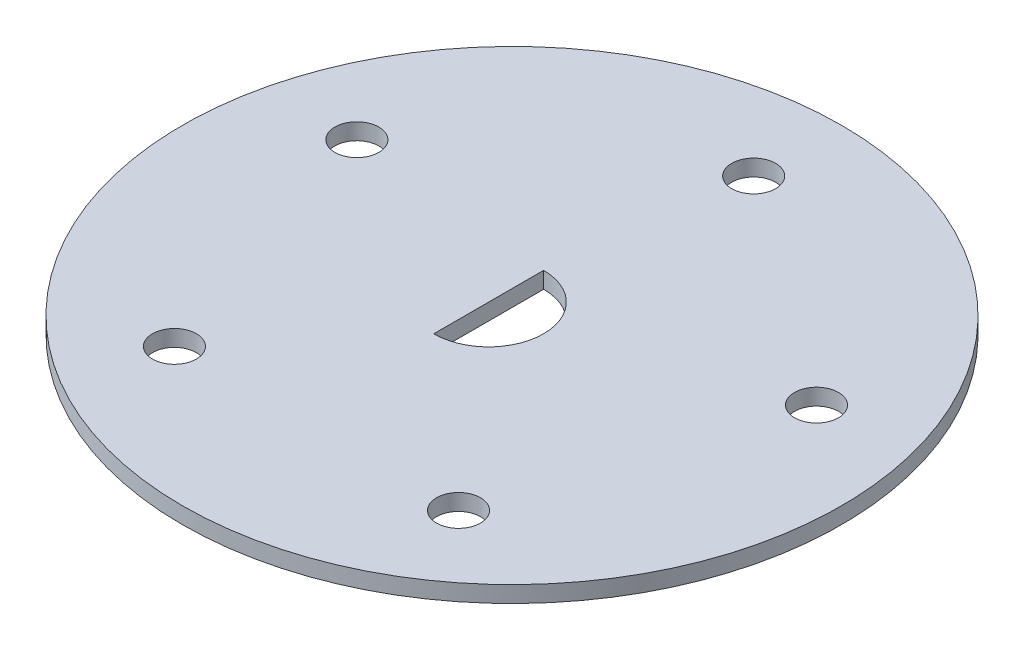
ISO-10303-21;
HEADER;
FILE_DESCRIPTION(('STEP AP214'),'2;1');
FILE_NAME('part.step','',(''),(''),'','','');
FILE_SCHEMA(('AUTOMOTIVE_DESIGN { 1 0 10303 214 1 1 1 1 }'));
ENDSEC;
DATA;
#1=APPLICATION_CONTEXT('core data for automotive mechanical design processes');
#2=APPLICATION_PROTOCOL_DEFINITION('international standard','automotive_design',2000,#1);
#3=PRODUCT_CONTEXT('',#1,'mechanical');
#4=PRODUCT('Part','Part','',(#3));
#5=PRODUCT_RELATED_PRODUCT_CATEGORY('part','',(#4));
#6=PRODUCT_DEFINITION_FORMATION('','',#4);
#7=PRODUCT_DEFINITION_CONTEXT('part definition',#1,'design');
#8=PRODUCT_DEFINITION('design','',#6,#7);
#9=PRODUCT_DEFINITION_SHAPE('','',#8);
#10=(LENGTH_UNIT() NAMED_UNIT(*) SI_UNIT(.MILLI.,.METRE.));
#11=(NAMED_UNIT(*) PLANE_ANGLE_UNIT() SI_UNIT($,.RADIAN.));
#12=(NAMED_UNIT(*) SI_UNIT($,.STERADIAN.) SOLID_ANGLE_UNIT());
#13=UNCERTAINTY_MEASURE_WITH_UNIT(LENGTH_MEASURE(1.E-05),#10,'distance_accuracy_value','');
#14=(GEOMETRIC_REPRESENTATION_CONTEXT(3) GLOBAL_UNCERTAINTY_ASSIGNED_CONTEXT((#13)) GLOBAL_UNIT_ASSIGNED_CONTEXT((#10,
#11,#12)) REPRESENTATION_CONTEXT('',''));
#15=CARTESIAN_POINT('',(0.,0.,0.));
#16=DIRECTION('',(0.,0.,1.));
#17=DIRECTION('',(1.,0.,0.));
#18=AXIS2_PLACEMENT_3D('',#15,#16,#17);
#19=CARTESIAN_POINT('',(-2.69502370610227,1.89738,0.));
#20=DIRECTION('',(1.,0.,0.));
#21=DIRECTION('',(0.,0.,-1.));
#22=AXIS2_PLACEMENT_3D('',#19,#20,#21);
#23=PLANE('',#22);
#24=DIRECTION('',(0.,0.,1.));
#25=VECTOR('',#24,1.);
#26=CARTESIAN_POINT('',(-2.69502370610227,0.,0.));
#27=LINE('',#26,#25);
#28=CARTESIAN_POINT('',(-2.69502370610227,0.,-6.35));
#29=VERTEX_POINT('',#28);
#30=CARTESIAN_POINT('',(-2.69502370610228,0.,6.35));
#31=VERTEX_POINT('',#30);
#32=EDGE_CURVE('E77',#29,#31,#27,.T.);
#33=ORIENTED_EDGE('',*,*,#32,.F.);
#34=DIRECTION('',(0.,-1.,0.));
#35=VECTOR('',#34,1.);
#36=CARTESIAN_POINT('',(-2.69502370610227,1.89738,-6.35));
#37=LINE('',#36,#35);
#38=CARTESIAN_POINT('',(-2.69502370610227,1.89738,-6.35));
#39=VERTEX_POINT('',#38);
#40=EDGE_CURVE('E11',#39,#29,#37,.T.);
#41=ORIENTED_EDGE('',*,*,#40,.F.);
#42=DIRECTION('',(0.,0.,1.));
#43=VECTOR('',#42,1.);
#44=CARTESIAN_POINT('',(-2.69502370610227,1.89738,0.));
#45=LINE('',#44,#43);
#46=CARTESIAN_POINT('',(-2.69502370610228,1.89738,6.35));
#47=VERTEX_POINT('',#46);
#48=EDGE_CURVE('E78',#39,#47,#45,.T.);
#49=ORIENTED_EDGE('',*,*,#48,.T.);
#50=DIRECTION('',(0.,-1.,0.));
#51=VECTOR('',#50,1.);
#52=CARTESIAN_POINT('',(-2.69502370610228,1.89738,6.35));
#53=LINE('',#52,#51);
#54=EDGE_CURVE('E57',#47,#31,#53,.T.);
#55=ORIENTED_EDGE('',*,*,#54,.T.);
#56=EDGE_LOOP('',(#33,#41,#49,#55));
#57=FACE_BOUND('',#56,.T.);
#58=ADVANCED_FACE('F47',(#57),#23,.T.);
#59=CARTESIAN_POINT('',(0.,1.89738,0.));
#60=DIRECTION('',(0.,-1.,0.));
#61=DIRECTION('',(0.,0.,-1.));
#62=AXIS2_PLACEMENT_3D('',#59,#60,#61);
#63=CYLINDRICAL_SURFACE('',#62,38.1);
#64=CARTESIAN_POINT('',(0.,1.89738,0.));
#65=DIRECTION('',(0.,1.,0.));
#66=DIRECTION('',(0.,0.,1.));
#67=AXIS2_PLACEMENT_3D('',#64,#65,#66);
#68=CIRCLE('',#67,38.1);
#69=CARTESIAN_POINT('',(0.,1.89738,-38.1));
#70=VERTEX_POINT('',#69);
#71=EDGE_CURVE('E118',#70,#70,#68,.T.);
#72=CARTESIAN_POINT('',(0.,0.,0.));
#73=DIRECTION('',(0.,1.,0.));
#74=DIRECTION('',(0.,0.,1.));
#75=AXIS2_PLACEMENT_3D('',#72,#73,#74);
#76=CIRCLE('',#75,38.1);
#77=CARTESIAN_POINT('',(0.,0.,-38.1));
#78=VERTEX_POINT('',#77);
#79=EDGE_CURVE('E88',#78,#78,#76,.T.);
#80=CARTESIAN_POINT('',(0.,1.89738,-38.1));
#81=CARTESIAN_POINT('',(0.,1.877615625,-38.1));
#82=CARTESIAN_POINT('',(0.,1.85785125,-38.1));
#83=CARTESIAN_POINT('',(0.,1.8183225,-38.1));
#84=CARTESIAN_POINT('',(0.,1.798558125,-38.1));
#85=CARTESIAN_POINT('',(0.,1.759029375,-38.1));
#86=CARTESIAN_POINT('',(0.,1.739265,-38.1));
#87=CARTESIAN_POINT('',(0.,1.69973625,-38.1));
#88=CARTESIAN_POINT('',(0.,1.679971875,-38.1));
#89=CARTESIAN_POINT('',(0.,1.640443125,-38.1));
#90=CARTESIAN_POINT('',(0.,1.62067875,-38.1));
#91=CARTESIAN_POINT('',(0.,1.58115,-38.1));
#92=CARTESIAN_POINT('',(0.,1.561385625,-38.1));
#93=CARTESIAN_POINT('',(0.,1.521856875,-38.1));
#94=CARTESIAN_POINT('',(0.,1.5020925,-38.1));
#95=CARTESIAN_POINT('',(0.,1.46256375,-38.1));
#96=CARTESIAN_POINT('',(0.,1.442799375,-38.1));
#97=CARTESIAN_POINT('',(0.,1.403270625,-38.1));
#98=CARTESIAN_POINT('',(0.,1.38350625,-38.1));
#99=CARTESIAN_POINT('',(0.,1.3439775,-38.1));
#100=CARTESIAN_POINT('',(0.,1.324213125,-38.1));
#101=CARTESIAN_POINT('',(0.,1.284684375,-38.1));
#102=CARTESIAN_POINT('',(0.,1.26492,-38.1));
#103=CARTESIAN_POINT('',(0.,1.22539125,-38.1));
#104=CARTESIAN_POINT('',(0.,1.205626875,-38.1));
#105=CARTESIAN_POINT('',(0.,1.166098125,-38.1));
#106=CARTESIAN_POINT('',(0.,1.14633375,-38.1));
#107=CARTESIAN_POINT('',(0.,1.106805,-38.1));
#108=CARTESIAN_POINT('',(0.,1.087040625,-38.1));
#109=CARTESIAN_POINT('',(0.,1.047511875,-38.1));
#110=CARTESIAN_POINT('',(0.,1.0277475,-38.1));
#111=CARTESIAN_POINT('',(0.,0.98821875,-38.1));
#112=CARTESIAN_POINT('',(0.,0.968454375,-38.1));
#113=CARTESIAN_POINT('',(0.,0.928925625,-38.1));
#114=CARTESIAN_POINT('',(0.,0.90916125,-38.1));
#115=CARTESIAN_POINT('',(0.,0.8696325,-38.1));
#116=CARTESIAN_POINT('',(0.,0.849868125,-38.1));
#117=CARTESIAN_POINT('',(0.,0.810339375,-38.1));
#118=CARTESIAN_POINT('',(0.,0.790575,-38.1));
#119=CARTESIAN_POINT('',(0.,0.75104625,-38.1));
#120=CARTESIAN_POINT('',(0.,0.731281875,-38.1));
#121=CARTESIAN_POINT('',(0.,0.691753125,-38.1));
#122=CARTESIAN_POINT('',(0.,0.67198875,-38.1));
#123=CARTESIAN_POINT('',(0.,0.63246,-38.1));
#124=CARTESIAN_POINT('',(0.,0.612695625,-38.1));
#125=CARTESIAN_POINT('',(0.,0.573166875,-38.1));
#126=CARTESIAN_POINT('',(0.,0.5534025,-38.1));
#127=CARTESIAN_POINT('',(0.,0.51387375,-38.1));
#128=CARTESIAN_POINT('',(0.,0.494109375,-38.1));
#129=CARTESIAN_POINT('',(0.,0.454580625,-38.1));
#130=CARTESIAN_POINT('',(0.,0.43481625,-38.1));
#131=CARTESIAN_POINT('',(0.,0.3952875,-38.1));
#132=CARTESIAN_POINT('',(0.,0.375523125,-38.1));
#133=CARTESIAN_POINT('',(0.,0.335994375,-38.1));
#134=CARTESIAN_POINT('',(0.,0.31623,-38.1));
#135=CARTESIAN_POINT('',(0.,0.27670125,-38.1));
#136=CARTESIAN_POINT('',(0.,0.256936875,-38.1));
#137=CARTESIAN_POINT('',(0.,0.217408125,-38.1));
#138=CARTESIAN_POINT('',(0.,0.19764375,-38.1));
#139=CARTESIAN_POINT('',(0.,0.158115,-38.1));
#140=CARTESIAN_POINT('',(0.,0.138350625,-38.1));
#141=CARTESIAN_POINT('',(0.,0.098821875,-38.1));
#142=CARTESIAN_POINT('',(0.,0.0790574999999999,-38.1));
#143=CARTESIAN_POINT('',(0.,0.0395287499999999,-38.1));
#144=CARTESIAN_POINT('',(0.,0.019764375,-38.1));
#145=CARTESIAN_POINT('',(0.,0.,-38.1));
#146=B_SPLINE_CURVE_WITH_KNOTS('',3,(#80,#81,#82,#83,#84,#85,#86,#87,#88,#89,#90,#91,#92,#93,
#94,#95,#96,#97,#98,#99,#100,#101,#102,#103,#104,#105,#106,#107,#108,#109,#110,#111,#112,#113,
#114,#115,#116,#117,#118,#119,#120,#121,#122,#123,#124,#125,#126,#127,#128,#129,#130,#131,#132,
#133,#134,#135,#136,#137,#138,#139,#140,#141,#142,#143,#144,#145),.UNSPECIFIED.,.F.,.F.,(4,2,2,
2,2,2,2,2,2,2,2,2,2,2,2,2,2,2,2,2,2,2,2,2,2,2,2,2,2,2,2,2,4),(0.,0.0592931249999999,0.11858625,
0.177879375,0.2371725,0.296465625,0.35575875,0.415051875,0.474345,0.533638125,0.59293125,
0.652224375,0.7115175,0.770810625,0.83010375,0.889396875,0.94869,1.007983125,1.06727625,
1.126569375,1.1858625,1.245155625,1.30444875,1.363741875,1.423035,1.482328125,1.54162125,
1.600914375,1.6602075,1.719500625,1.77879375,1.838086875,1.89738),.UNSPECIFIED.);
#147=EDGE_CURVE('BSEAM158',#70,#78,#146,.T.);
#148=ORIENTED_EDGE('',*,*,#71,.F.);
#149=ORIENTED_EDGE('',*,*,#79,.T.);
#150=ORIENTED_EDGE('',*,*,#147,.T.);
#151=ORIENTED_EDGE('',*,*,#147,.F.);
#152=EDGE_LOOP('',(#148,#150,#149,#151));
#153=FACE_BOUND('',#152,.T.);
#154=ADVANCED_FACE('F158',(#153),#63,.T.);
#155=CARTESIAN_POINT('',(0.,1.89738,-27.94));
#156=DIRECTION('',(0.,-1.,0.));
#157=DIRECTION('',(0.,0.,-1.));
#158=AXIS2_PLACEMENT_3D('',#155,#156,#157);
#159=CYLINDRICAL_SURFACE('',#158,2.54);
#160=CARTESIAN_POINT('',(0.,1.89738,-27.94));
#161=DIRECTION('',(0.,1.,0.));
#162=DIRECTION('',(0.,0.,1.));
#163=AXIS2_PLACEMENT_3D('',#160,#161,#162);
#164=CIRCLE('',#163,2.54);
#165=CARTESIAN_POINT('',(0.,1.89738,-30.48));
#166=VERTEX_POINT('',#165);
#167=EDGE_CURVE('E122',#166,#166,#164,.T.);
#168=CARTESIAN_POINT('',(0.,0.,-27.94));
#169=DIRECTION('',(0.,1.,0.));
#170=DIRECTION('',(0.,0.,1.));
#171=AXIS2_PLACEMENT_3D('',#168,#169,#170);
#172=CIRCLE('',#171,2.54);
#173=CARTESIAN_POINT('',(0.,0.,-30.48));
#174=VERTEX_POINT('',#173);
#175=EDGE_CURVE('E92',#174,#174,#172,.T.);
#176=CARTESIAN_POINT('',(0.,1.89738,-30.48));
#177=CARTESIAN_POINT('',(0.,1.877615625,-30.48));
#178=CARTESIAN_POINT('',(0.,1.85785125,-30.48));
#179=CARTESIAN_POINT('',(0.,1.8183225,-30.48));
#180=CARTESIAN_POINT('',(0.,1.798558125,-30.48));
#181=CARTESIAN_POINT('',(0.,1.759029375,-30.48));
#182=CARTESIAN_POINT('',(0.,1.739265,-30.48));
#183=CARTESIAN_POINT('',(0.,1.69973625,-30.48));
#184=CARTESIAN_POINT('',(0.,1.679971875,-30.48));
#185=CARTESIAN_POINT('',(0.,1.640443125,-30.48));
#186=CARTESIAN_POINT('',(0.,1.62067875,-30.48));
#187=CARTESIAN_POINT('',(0.,1.58115,-30.48));
#188=CARTESIAN_POINT('',(0.,1.561385625,-30.48));
#189=CARTESIAN_POINT('',(0.,1.521856875,-30.48));
#190=CARTESIAN_POINT('',(0.,1.5020925,-30.48));
#191=CARTESIAN_POINT('',(0.,1.46256375,-30.48));
#192=CARTESIAN_POINT('',(0.,1.442799375,-30.48));
#193=CARTESIAN_POINT('',(0.,1.403270625,-30.48));
#194=CARTESIAN_POINT('',(0.,1.38350625,-30.48));
#195=CARTESIAN_POINT('',(0.,1.3439775,-30.48));
#196=CARTESIAN_POINT('',(0.,1.324213125,-30.48));
#197=CARTESIAN_POINT('',(0.,1.284684375,-30.48));
#198=CARTESIAN_POINT('',(0.,1.26492,-30.48));
#199=CARTESIAN_POINT('',(0.,1.22539125,-30.48));
#200=CARTESIAN_POINT('',(0.,1.205626875,-30.48));
#201=CARTESIAN_POINT('',(0.,1.166098125,-30.48));
#202=CARTESIAN_POINT('',(0.,1.14633375,-30.48));
#203=CARTESIAN_POINT('',(0.,1.106805,-30.48));
#204=CARTESIAN_POINT('',(0.,1.087040625,-30.48));
#205=CARTESIAN_POINT('',(0.,1.047511875,-30.48));
#206=CARTESIAN_POINT('',(0.,1.0277475,-30.48));
#207=CARTESIAN_POINT('',(0.,0.98821875,-30.48));
#208=CARTESIAN_POINT('',(0.,0.968454375,-30.48));
#209=CARTESIAN_POINT('',(0.,0.928925625,-30.48));
#210=CARTESIAN_POINT('',(0.,0.90916125,-30.48));
#211=CARTESIAN_POINT('',(0.,0.8696325,-30.48));
#212=CARTESIAN_POINT('',(0.,0.849868125,-30.48));
#213=CARTESIAN_POINT('',(0.,0.810339375,-30.48));
#214=CARTESIAN_POINT('',(0.,0.790575,-30.48));
#215=CARTESIAN_POINT('',(0.,0.75104625,-30.48));
#216=CARTESIAN_POINT('',(0.,0.731281875,-30.48));
#217=CARTESIAN_POINT('',(0.,0.691753125,-30.48));
#218=CARTESIAN_POINT('',(0.,0.67198875,-30.48));
#219=CARTESIAN_POINT('',(0.,0.63246,-30.48));
#220=CARTESIAN_POINT('',(0.,0.612695625,-30.48));
#221=CARTESIAN_POINT('',(0.,0.573166875,-30.48));
#222=CARTESIAN_POINT('',(0.,0.5534025,-30.48));
#223=CARTESIAN_POINT('',(0.,0.51387375,-30.48));
#224=CARTESIAN_POINT('',(0.,0.494109375,-30.48));
#225=CARTESIAN_POINT('',(0.,0.454580625,-30.48));
#226=CARTESIAN_POINT('',(0.,0.43481625,-30.48));
#227=CARTESIAN_POINT('',(0.,0.3952875,-30.48));
#228=CARTESIAN_POINT('',(0.,0.375523125,-30.48));
#229=CARTESIAN_POINT('',(0.,0.335994375,-30.48));
#230=CARTESIAN_POINT('',(0.,0.31623,-30.48));
#231=CARTESIAN_POINT('',(0.,0.27670125,-30.48));
#232=CARTESIAN_POINT('',(0.,0.256936875,-30.48));
#233=CARTESIAN_POINT('',(0.,0.217408125,-30.48));
#234=CARTESIAN_POINT('',(0.,0.19764375,-30.48));
#235=CARTESIAN_POINT('',(0.,0.158115,-30.48));
#236=CARTESIAN_POINT('',(0.,0.138350625,-30.48));
#237=CARTESIAN_POINT('',(0.,0.098821875,-30.48));
#238=CARTESIAN_POINT('',(0.,0.0790574999999999,-30.48));
#239=CARTESIAN_POINT('',(0.,0.0395287499999999,-30.48));
#240=CARTESIAN_POINT('',(0.,0.019764375,-30.48));
#241=CARTESIAN_POINT('',(0.,0.,-30.48));
#242=B_SPLINE_CURVE_WITH_KNOTS('',3,(#176,#177,#178,#179,#180,#181,#182,#183,#184,#185,#186,
#187,#188,#189,#190,#191,#192,#193,#194,#195,#196,#197,#198,#199,#200,#201,#202,#203,#204,#205,
#206,#207,#208,#209,#210,#211,#212,#213,#214,#215,#216,#217,#218,#219,#220,#221,#222,#223,#224,
#225,#226,#227,#228,#229,#230,#231,#232,#233,#234,#235,#236,#237,#238,#239,#240,#241),
.UNSPECIFIED.,.F.,.F.,(4,2,2,2,2,2,2,2,2,2,2,2,2,2,2,2,2,2,2,2,2,2,2,2,2,2,2,2,2,2,2,2,4),(0.,
0.0592931249999999,0.11858625,0.177879375,0.2371725,0.296465625,0.35575875,0.415051875,0.474345,
0.533638125,0.59293125,0.652224375,0.7115175,0.770810625,0.83010375,0.889396875,0.94869,
1.007983125,1.06727625,1.126569375,1.1858625,1.245155625,1.30444875,1.363741875,1.423035,
1.482328125,1.54162125,1.600914375,1.6602075,1.719500625,1.77879375,1.838086875,1.89738),.UNSPECIFIED.);
#243=EDGE_CURVE('BSEAM161',#166,#174,#242,.T.);
#244=ORIENTED_EDGE('',*,*,#167,.T.);
#245=ORIENTED_EDGE('',*,*,#175,.F.);
#246=ORIENTED_EDGE('',*,*,#243,.T.);
#247=ORIENTED_EDGE('',*,*,#243,.F.);
#248=EDGE_LOOP('',(#244,#246,#245,#247));
#249=FACE_BOUND('',#248,.T.);
#250=ADVANCED_FACE('F161',(#249),#159,.F.);
#251=CARTESIAN_POINT('',(26.5725190652866,1.89738,-8.63393482283596));
#252=DIRECTION('',(0.,-1.,0.));
#253=DIRECTION('',(0.,0.,-1.));
#254=AXIS2_PLACEMENT_3D('',#251,#252,#253);
#255=CYLINDRICAL_SURFACE('',#254,2.54000000000001);
#256=CARTESIAN_POINT('',(26.5725190652866,1.89738,-8.63393482283596));
#257=DIRECTION('',(0.,1.,0.));
#258=DIRECTION('',(0.,0.,1.));
#259=AXIS2_PLACEMENT_3D('',#256,#257,#258);
#260=CIRCLE('',#259,2.54000000000001);
#261=CARTESIAN_POINT('',(26.5725190652866,1.89738,-11.173934822836));
#262=VERTEX_POINT('',#261);
#263=EDGE_CURVE('E126',#262,#262,#260,.T.);
#264=CARTESIAN_POINT('',(26.5725190652866,0.,-8.63393482283596));
#265=DIRECTION('',(0.,1.,0.));
#266=DIRECTION('',(0.,0.,1.));
#267=AXIS2_PLACEMENT_3D('',#264,#265,#266);
#268=CIRCLE('',#267,2.54000000000001);
#269=CARTESIAN_POINT('',(26.5725190652866,0.,-11.173934822836));
#270=VERTEX_POINT('',#269);
#271=EDGE_CURVE('E98',#270,#270,#268,.T.);
#272=CARTESIAN_POINT('',(26.5725190652866,1.89738,-11.173934822836));
#273=CARTESIAN_POINT('',(26.5725190652866,1.877615625,-11.173934822836));
#274=CARTESIAN_POINT('',(26.5725190652866,1.85785125,-11.173934822836));
#275=CARTESIAN_POINT('',(26.5725190652866,1.8183225,-11.173934822836));
#276=CARTESIAN_POINT('',(26.5725190652866,1.798558125,-11.173934822836));
#277=CARTESIAN_POINT('',(26.5725190652866,1.759029375,-11.173934822836));
#278=CARTESIAN_POINT('',(26.5725190652866,1.739265,-11.173934822836));
#279=CARTESIAN_POINT('',(26.5725190652866,1.69973625,-11.173934822836));
#280=CARTESIAN_POINT('',(26.5725190652866,1.679971875,-11.173934822836));
#281=CARTESIAN_POINT('',(26.5725190652866,1.640443125,-11.173934822836));
#282=CARTESIAN_POINT('',(26.5725190652866,1.62067875,-11.173934822836));
#283=CARTESIAN_POINT('',(26.5725190652866,1.58115,-11.173934822836));
#284=CARTESIAN_POINT('',(26.5725190652866,1.561385625,-11.173934822836));
#285=CARTESIAN_POINT('',(26.5725190652866,1.521856875,-11.173934822836));
#286=CARTESIAN_POINT('',(26.5725190652866,1.5020925,-11.173934822836));
#287=CARTESIAN_POINT('',(26.5725190652866,1.46256375,-11.173934822836));
#288=CARTESIAN_POINT('',(26.5725190652866,1.442799375,-11.173934822836));
#289=CARTESIAN_POINT('',(26.5725190652866,1.403270625,-11.173934822836));
#290=CARTESIAN_POINT('',(26.5725190652866,1.38350625,-11.173934822836));
#291=CARTESIAN_POINT('',(26.5725190652866,1.3439775,-11.173934822836));
#292=CARTESIAN_POINT('',(26.5725190652866,1.324213125,-11.173934822836));
#293=CARTESIAN_POINT('',(26.5725190652866,1.284684375,-11.173934822836));
#294=CARTESIAN_POINT('',(26.5725190652866,1.26492,-11.173934822836));
#295=CARTESIAN_POINT('',(26.5725190652866,1.22539125,-11.173934822836));
#296=CARTESIAN_POINT('',(26.5725190652866,1.205626875,-11.173934822836));
#297=CARTESIAN_POINT('',(26.5725190652866,1.166098125,-11.173934822836));
#298=CARTESIAN_POINT('',(26.5725190652866,1.14633375,-11.173934822836));
#299=CARTESIAN_POINT('',(26.5725190652866,1.106805,-11.173934822836));
#300=CARTESIAN_POINT('',(26.5725190652866,1.087040625,-11.173934822836));
#301=CARTESIAN_POINT('',(26.5725190652866,1.047511875,-11.173934822836));
#302=CARTESIAN_POINT('',(26.5725190652866,1.0277475,-11.173934822836));
#303=CARTESIAN_POINT('',(26.5725190652866,0.98821875,-11.173934822836));
#304=CARTESIAN_POINT('',(26.5725190652866,0.968454375,-11.173934822836));
#305=CARTESIAN_POINT('',(26.5725190652866,0.928925625,-11.173934822836));
#306=CARTESIAN_POINT('',(26.5725190652866,0.90916125,-11.173934822836));
#307=CARTESIAN_POINT('',(26.5725190652866,0.8696325,-11.173934822836));
#308=CARTESIAN_POINT('',(26.5725190652866,0.849868125,-11.173934822836));
#309=CARTESIAN_POINT('',(26.5725190652866,0.810339375,-11.173934822836));
#310=CARTESIAN_POINT('',(26.5725190652866,0.790575,-11.173934822836));
#311=CARTESIAN_POINT('',(26.5725190652866,0.75104625,-11.173934822836));
#312=CARTESIAN_POINT('',(26.5725190652866,0.731281875,-11.173934822836));
#313=CARTESIAN_POINT('',(26.5725190652866,0.691753125,-11.173934822836));
#314=CARTESIAN_POINT('',(26.5725190652866,0.67198875,-11.173934822836));
#315=CARTESIAN_POINT('',(26.5725190652866,0.63246,-11.173934822836));
#316=CARTESIAN_POINT('',(26.5725190652866,0.612695625,-11.173934822836));
#317=CARTESIAN_POINT('',(26.5725190652866,0.573166875,-11.173934822836));
#318=CARTESIAN_POINT('',(26.5725190652866,0.5534025,-11.173934822836));
#319=CARTESIAN_POINT('',(26.5725190652866,0.51387375,-11.173934822836));
#320=CARTESIAN_POINT('',(26.5725190652866,0.494109375,-11.173934822836));
#321=CARTESIAN_POINT('',(26.5725190652866,0.454580625,-11.173934822836));
#322=CARTESIAN_POINT('',(26.5725190652866,0.43481625,-11.173934822836));
#323=CARTESIAN_POINT('',(26.5725190652866,0.3952875,-11.173934822836));
#324=CARTESIAN_POINT('',(26.5725190652866,0.375523125,-11.173934822836));
#325=CARTESIAN_POINT('',(26.5725190652866,0.335994375,-11.173934822836));
#326=CARTESIAN_POINT('',(26.5725190652866,0.31623,-11.173934822836));
#327=CARTESIAN_POINT('',(26.5725190652866,0.27670125,-11.173934822836));
#328=CARTESIAN_POINT('',(26.5725190652866,0.256936875,-11.173934822836));
#329=CARTESIAN_POINT('',(26.5725190652866,0.217408125,-11.173934822836));
#330=CARTESIAN_POINT('',(26.5725190652866,0.19764375,-11.173934822836));
#331=CARTESIAN_POINT('',(26.5725190652866,0.158115,-11.173934822836));
#332=CARTESIAN_POINT('',(26.5725190652866,0.138350625,-11.173934822836));
#333=CARTESIAN_POINT('',(26.5725190652866,0.098821875,-11.173934822836));
#334=CARTESIAN_POINT('',(26.5725190652866,0.0790574999999999,-11.173934822836));
#335=CARTESIAN_POINT('',(26.5725190652866,0.0395287499999999,-11.173934822836));
#336=CARTESIAN_POINT('',(26.5725190652866,0.019764375,-11.173934822836));
#337=CARTESIAN_POINT('',(26.5725190652866,0.,-11.173934822836));
#338=B_SPLINE_CURVE_WITH_KNOTS('',3,(#272,#273,#274,#275,#276,#277,#278,#279,#280,#281,#282,
#283,#284,#285,#286,#287,#288,#289,#290,#291,#292,#293,#294,#295,#296,#297,#298,#299,#300,#301,
#302,#303,#304,#305,#306,#307,#308,#309,#310,#311,#312,#313,#314,#315,#316,#317,#318,#319,#320,
#321,#322,#323,#324,#325,#326,#327,#328,#329,#330,#331,#332,#333,#334,#335,#336,#337),
.UNSPECIFIED.,.F.,.F.,(4,2,2,2,2,2,2,2,2,2,2,2,2,2,2,2,2,2,2,2,2,2,2,2,2,2,2,2,2,2,2,2,4),(0.,
0.0592931249999999,0.11858625,0.177879375,0.2371725,0.296465625,0.35575875,0.415051875,0.474345,
0.533638125,0.59293125,0.652224375,0.7115175,0.770810625,0.83010375,0.889396875,0.94869,
1.007983125,1.06727625,1.126569375,1.1858625,1.245155625,1.30444875,1.363741875,1.423035,
1.482328125,1.54162125,1.600914375,1.6602075,1.719500625,1.77879375,1.838086875,1.89738),.UNSPECIFIED.);
#339=EDGE_CURVE('BSEAM179',#262,#270,#338,.T.);
#340=ORIENTED_EDGE('',*,*,#263,.T.);
#341=ORIENTED_EDGE('',*,*,#271,.F.);
#342=ORIENTED_EDGE('',*,*,#339,.T.);
#343=ORIENTED_EDGE('',*,*,#339,.F.);
#344=EDGE_LOOP('',(#340,#342,#341,#343));
#345=FACE_BOUND('',#344,.T.);
#346=ADVANCED_FACE('F179',(#345),#255,.F.);
#347=CARTESIAN_POINT('',(16.4227199490516,1.89738,22.6039348228361));
#348=DIRECTION('',(0.,-1.,0.));
#349=DIRECTION('',(0.,0.,-1.));
#350=AXIS2_PLACEMENT_3D('',#347,#348,#349);
#351=CYLINDRICAL_SURFACE('',#350,2.54);
#352=CARTESIAN_POINT('',(16.4227199490516,1.89738,22.6039348228361));
#353=DIRECTION('',(0.,1.,0.));
#354=DIRECTION('',(0.,0.,1.));
#355=AXIS2_PLACEMENT_3D('',#352,#353,#354);
#356=CIRCLE('',#355,2.54);
#357=CARTESIAN_POINT('',(16.4227199490516,1.89738,20.0639348228361));
#358=VERTEX_POINT('',#357);
#359=EDGE_CURVE('E130',#358,#358,#356,.T.);
#360=CARTESIAN_POINT('',(16.4227199490516,0.,22.6039348228361));
#361=DIRECTION('',(0.,1.,0.));
#362=DIRECTION('',(0.,0.,1.));
#363=AXIS2_PLACEMENT_3D('',#360,#361,#362);
#364=CIRCLE('',#363,2.54);
#365=CARTESIAN_POINT('',(16.4227199490516,0.,20.0639348228361));
#366=VERTEX_POINT('',#365);
#367=EDGE_CURVE('E102',#366,#366,#364,.T.);
#368=CARTESIAN_POINT('',(16.4227199490516,1.89738,20.0639348228361));
#369=CARTESIAN_POINT('',(16.4227199490516,1.877615625,20.0639348228361));
#370=CARTESIAN_POINT('',(16.4227199490516,1.85785125,20.0639348228361));
#371=CARTESIAN_POINT('',(16.4227199490516,1.8183225,20.0639348228361));
#372=CARTESIAN_POINT('',(16.4227199490516,1.798558125,20.0639348228361));
#373=CARTESIAN_POINT('',(16.4227199490516,1.759029375,20.0639348228361));
#374=CARTESIAN_POINT('',(16.4227199490516,1.739265,20.0639348228361));
#375=CARTESIAN_POINT('',(16.4227199490516,1.69973625,20.0639348228361));
#376=CARTESIAN_POINT('',(16.4227199490516,1.679971875,20.0639348228361));
#377=CARTESIAN_POINT('',(16.4227199490516,1.640443125,20.0639348228361));
#378=CARTESIAN_POINT('',(16.4227199490516,1.62067875,20.0639348228361));
#379=CARTESIAN_POINT('',(16.4227199490516,1.58115,20.0639348228361));
#380=CARTESIAN_POINT('',(16.4227199490516,1.561385625,20.0639348228361));
#381=CARTESIAN_POINT('',(16.4227199490516,1.521856875,20.0639348228361));
#382=CARTESIAN_POINT('',(16.4227199490516,1.5020925,20.0639348228361));
#383=CARTESIAN_POINT('',(16.4227199490516,1.46256375,20.0639348228361));
#384=CARTESIAN_POINT('',(16.4227199490516,1.442799375,20.0639348228361));
#385=CARTESIAN_POINT('',(16.4227199490516,1.403270625,20.0639348228361));
#386=CARTESIAN_POINT('',(16.4227199490516,1.38350625,20.0639348228361));
#387=CARTESIAN_POINT('',(16.4227199490516,1.3439775,20.0639348228361));
#388=CARTESIAN_POINT('',(16.4227199490516,1.324213125,20.0639348228361));
#389=CARTESIAN_POINT('',(16.4227199490516,1.284684375,20.0639348228361));
#390=CARTESIAN_POINT('',(16.4227199490516,1.26492,20.0639348228361));
#391=CARTESIAN_POINT('',(16.4227199490516,1.22539125,20.0639348228361));
#392=CARTESIAN_POINT('',(16.4227199490516,1.205626875,20.0639348228361));
#393=CARTESIAN_POINT('',(16.4227199490516,1.166098125,20.0639348228361));
#394=CARTESIAN_POINT('',(16.4227199490516,1.14633375,20.0639348228361));
#395=CARTESIAN_POINT('',(16.4227199490516,1.106805,20.0639348228361));
#396=CARTESIAN_POINT('',(16.4227199490516,1.087040625,20.0639348228361));
#397=CARTESIAN_POINT('',(16.4227199490516,1.047511875,20.0639348228361));
#398=CARTESIAN_POINT('',(16.4227199490516,1.0277475,20.0639348228361));
#399=CARTESIAN_POINT('',(16.4227199490516,0.98821875,20.0639348228361));
#400=CARTESIAN_POINT('',(16.4227199490516,0.968454375,20.0639348228361));
#401=CARTESIAN_POINT('',(16.4227199490516,0.928925625,20.0639348228361));
#402=CARTESIAN_POINT('',(16.4227199490516,0.90916125,20.0639348228361));
#403=CARTESIAN_POINT('',(16.4227199490516,0.8696325,20.0639348228361));
#404=CARTESIAN_POINT('',(16.4227199490516,0.849868125,20.0639348228361));
#405=CARTESIAN_POINT('',(16.4227199490516,0.810339375,20.0639348228361));
#406=CARTESIAN_POINT('',(16.4227199490516,0.790575,20.0639348228361));
#407=CARTESIAN_POINT('',(16.4227199490516,0.75104625,20.0639348228361));
#408=CARTESIAN_POINT('',(16.4227199490516,0.731281875,20.0639348228361));
#409=CARTESIAN_POINT('',(16.4227199490516,0.691753125,20.0639348228361));
#410=CARTESIAN_POINT('',(16.4227199490516,0.67198875,20.0639348228361));
#411=CARTESIAN_POINT('',(16.4227199490516,0.63246,20.0639348228361));
#412=CARTESIAN_POINT('',(16.4227199490516,0.612695625,20.0639348228361));
#413=CARTESIAN_POINT('',(16.4227199490516,0.573166875,20.0639348228361));
#414=CARTESIAN_POINT('',(16.4227199490516,0.5534025,20.0639348228361));
#415=CARTESIAN_POINT('',(16.4227199490516,0.51387375,20.0639348228361));
#416=CARTESIAN_POINT('',(16.4227199490516,0.494109375,20.0639348228361));
#417=CARTESIAN_POINT('',(16.4227199490516,0.454580625,20.0639348228361));
#418=CARTESIAN_POINT('',(16.4227199490516,0.43481625,20.0639348228361));
#419=CARTESIAN_POINT('',(16.4227199490516,0.3952875,20.0639348228361));
#420=CARTESIAN_POINT('',(16.4227199490516,0.375523125,20.0639348228361));
#421=CARTESIAN_POINT('',(16.4227199490516,0.335994375,20.0639348228361));
#422=CARTESIAN_POINT('',(16.4227199490516,0.31623,20.0639348228361));
#423=CARTESIAN_POINT('',(16.4227199490516,0.27670125,20.0639348228361));
#424=CARTESIAN_POINT('',(16.4227199490516,0.256936875,20.0639348228361));
#425=CARTESIAN_POINT('',(16.4227199490516,0.217408125,20.0639348228361));
#426=CARTESIAN_POINT('',(16.4227199490516,0.19764375,20.0639348228361));
#427=CARTESIAN_POINT('',(16.4227199490516,0.158115,20.0639348228361));
#428=CARTESIAN_POINT('',(16.4227199490516,0.138350625,20.0639348228361));
#429=CARTESIAN_POINT('',(16.4227199490516,0.098821875,20.0639348228361));
#430=CARTESIAN_POINT('',(16.4227199490516,0.0790574999999999,20.0639348228361));
#431=CARTESIAN_POINT('',(16.4227199490516,0.0395287499999999,20.0639348228361));
#432=CARTESIAN_POINT('',(16.4227199490516,0.019764375,20.0639348228361));
#433=CARTESIAN_POINT('',(16.4227199490516,0.,20.0639348228361));
#434=B_SPLINE_CURVE_WITH_KNOTS('',3,(#368,#369,#370,#371,#372,#373,#374,#375,#376,#377,#378,
#379,#380,#381,#382,#383,#384,#385,#386,#387,#388,#389,#390,#391,#392,#393,#394,#395,#396,#397,
#398,#399,#400,#401,#402,#403,#404,#405,#406,#407,#408,#409,#410,#411,#412,#413,#414,#415,#416,
#417,#418,#419,#420,#421,#422,#423,#424,#425,#426,#427,#428,#429,#430,#431,#432,#433),
.UNSPECIFIED.,.F.,.F.,(4,2,2,2,2,2,2,2,2,2,2,2,2,2,2,2,2,2,2,2,2,2,2,2,2,2,2,2,2,2,2,2,4),(0.,
0.0592931249999999,0.11858625,0.177879375,0.2371725,0.296465625,0.35575875,0.415051875,0.474345,
0.533638125,0.59293125,0.652224375,0.7115175,0.770810625,0.83010375,0.889396875,0.94869,
1.007983125,1.06727625,1.126569375,1.1858625,1.245155625,1.30444875,1.363741875,1.423035,
1.482328125,1.54162125,1.600914375,1.6602075,1.719500625,1.77879375,1.838086875,1.89738),.UNSPECIFIED.);
#435=EDGE_CURVE('BSEAM183',#358,#366,#434,.T.);
#436=ORIENTED_EDGE('',*,*,#359,.T.);
#437=ORIENTED_EDGE('',*,*,#367,.F.);
#438=ORIENTED_EDGE('',*,*,#435,.T.);
#439=ORIENTED_EDGE('',*,*,#435,.F.);
#440=EDGE_LOOP('',(#436,#438,#437,#439));
#441=FACE_BOUND('',#440,.T.);
#442=ADVANCED_FACE('F183',(#441),#351,.F.);
#443=CARTESIAN_POINT('',(-16.4227199490519,1.89738,22.6039348228359));
#444=DIRECTION('',(0.,-1.,0.));
#445=DIRECTION('',(0.,0.,-1.));
#446=AXIS2_PLACEMENT_3D('',#443,#444,#445);
#447=CYLINDRICAL_SURFACE('',#446,2.54);
#448=CARTESIAN_POINT('',(-16.4227199490519,1.89738,22.6039348228359));
#449=DIRECTION('',(0.,1.,0.));
#450=DIRECTION('',(0.,0.,1.));
#451=AXIS2_PLACEMENT_3D('',#448,#449,#450);
#452=CIRCLE('',#451,2.54);
#453=CARTESIAN_POINT('',(-16.4227199490519,1.89738,20.0639348228359));
#454=VERTEX_POINT('',#453);
#455=EDGE_CURVE('E134',#454,#454,#452,.T.);
#456=CARTESIAN_POINT('',(-16.4227199490519,0.,22.6039348228359));
#457=DIRECTION('',(0.,1.,0.));
#458=DIRECTION('',(0.,0.,1.));
#459=AXIS2_PLACEMENT_3D('',#456,#457,#458);
#460=CIRCLE('',#459,2.54);
#461=CARTESIAN_POINT('',(-16.4227199490519,0.,20.0639348228359));
#462=VERTEX_POINT('',#461);
#463=EDGE_CURVE('E106',#462,#462,#460,.T.);
#464=CARTESIAN_POINT('',(-16.4227199490519,1.89738,20.0639348228359));
#465=CARTESIAN_POINT('',(-16.4227199490519,1.877615625,20.0639348228359));
#466=CARTESIAN_POINT('',(-16.4227199490519,1.85785125,20.0639348228359));
#467=CARTESIAN_POINT('',(-16.4227199490519,1.8183225,20.0639348228359));
#468=CARTESIAN_POINT('',(-16.4227199490519,1.798558125,20.0639348228359));
#469=CARTESIAN_POINT('',(-16.4227199490519,1.759029375,20.0639348228359));
#470=CARTESIAN_POINT('',(-16.4227199490519,1.739265,20.0639348228359));
#471=CARTESIAN_POINT('',(-16.4227199490519,1.69973625,20.0639348228359));
#472=CARTESIAN_POINT('',(-16.4227199490519,1.679971875,20.0639348228359));
#473=CARTESIAN_POINT('',(-16.4227199490519,1.640443125,20.0639348228359));
#474=CARTESIAN_POINT('',(-16.4227199490519,1.62067875,20.0639348228359));
#475=CARTESIAN_POINT('',(-16.4227199490519,1.58115,20.0639348228359));
#476=CARTESIAN_POINT('',(-16.4227199490519,1.561385625,20.0639348228359));
#477=CARTESIAN_POINT('',(-16.4227199490519,1.521856875,20.0639348228359));
#478=CARTESIAN_POINT('',(-16.4227199490519,1.5020925,20.0639348228359));
#479=CARTESIAN_POINT('',(-16.4227199490519,1.46256375,20.0639348228359));
#480=CARTESIAN_POINT('',(-16.4227199490519,1.442799375,20.0639348228359));
#481=CARTESIAN_POINT('',(-16.4227199490519,1.403270625,20.0639348228359));
#482=CARTESIAN_POINT('',(-16.4227199490519,1.38350625,20.0639348228359));
#483=CARTESIAN_POINT('',(-16.4227199490519,1.3439775,20.0639348228359));
#484=CARTESIAN_POINT('',(-16.4227199490519,1.324213125,20.0639348228359));
#485=CARTESIAN_POINT('',(-16.4227199490519,1.284684375,20.0639348228359));
#486=CARTESIAN_POINT('',(-16.4227199490519,1.26492,20.0639348228359));
#487=CARTESIAN_POINT('',(-16.4227199490519,1.22539125,20.0639348228359));
#488=CARTESIAN_POINT('',(-16.4227199490519,1.205626875,20.0639348228359));
#489=CARTESIAN_POINT('',(-16.4227199490519,1.166098125,20.0639348228359));
#490=CARTESIAN_POINT('',(-16.4227199490519,1.14633375,20.0639348228359));
#491=CARTESIAN_POINT('',(-16.4227199490519,1.106805,20.0639348228359));
#492=CARTESIAN_POINT('',(-16.4227199490519,1.087040625,20.0639348228359));
#493=CARTESIAN_POINT('',(-16.4227199490519,1.047511875,20.0639348228359));
#494=CARTESIAN_POINT('',(-16.4227199490519,1.0277475,20.0639348228359));
#495=CARTESIAN_POINT('',(-16.4227199490519,0.98821875,20.0639348228359));
#496=CARTESIAN_POINT('',(-16.4227199490519,0.968454375,20.0639348228359));
#497=CARTESIAN_POINT('',(-16.4227199490519,0.928925625,20.0639348228359));
#498=CARTESIAN_POINT('',(-16.4227199490519,0.90916125,20.0639348228359));
#499=CARTESIAN_POINT('',(-16.4227199490519,0.8696325,20.0639348228359));
#500=CARTESIAN_POINT('',(-16.4227199490519,0.849868125,20.0639348228359));
#501=CARTESIAN_POINT('',(-16.4227199490519,0.810339375,20.0639348228359));
#502=CARTESIAN_POINT('',(-16.4227199490519,0.790575,20.0639348228359));
#503=CARTESIAN_POINT('',(-16.4227199490519,0.75104625,20.0639348228359));
#504=CARTESIAN_POINT('',(-16.4227199490519,0.731281875,20.0639348228359));
#505=CARTESIAN_POINT('',(-16.4227199490519,0.691753125,20.0639348228359));
#506=CARTESIAN_POINT('',(-16.4227199490519,0.67198875,20.0639348228359));
#507=CARTESIAN_POINT('',(-16.4227199490519,0.63246,20.0639348228359));
#508=CARTESIAN_POINT('',(-16.4227199490519,0.612695625,20.0639348228359));
#509=CARTESIAN_POINT('',(-16.4227199490519,0.573166875,20.0639348228359));
#510=CARTESIAN_POINT('',(-16.4227199490519,0.5534025,20.0639348228359));
#511=CARTESIAN_POINT('',(-16.4227199490519,0.51387375,20.0639348228359));
#512=CARTESIAN_POINT('',(-16.4227199490519,0.494109375,20.0639348228359));
#513=CARTESIAN_POINT('',(-16.4227199490519,0.454580625,20.0639348228359));
#514=CARTESIAN_POINT('',(-16.4227199490519,0.43481625,20.0639348228359));
#515=CARTESIAN_POINT('',(-16.4227199490519,0.3952875,20.0639348228359));
#516=CARTESIAN_POINT('',(-16.4227199490519,0.375523125,20.0639348228359));
#517=CARTESIAN_POINT('',(-16.4227199490519,0.335994375,20.0639348228359));
#518=CARTESIAN_POINT('',(-16.4227199490519,0.31623,20.0639348228359));
#519=CARTESIAN_POINT('',(-16.4227199490519,0.27670125,20.0639348228359));
#520=CARTESIAN_POINT('',(-16.4227199490519,0.256936875,20.0639348228359));
#521=CARTESIAN_POINT('',(-16.4227199490519,0.217408125,20.0639348228359));
#522=CARTESIAN_POINT('',(-16.4227199490519,0.19764375,20.0639348228359));
#523=CARTESIAN_POINT('',(-16.4227199490519,0.158115,20.0639348228359));
#524=CARTESIAN_POINT('',(-16.4227199490519,0.138350625,20.0639348228359));
#525=CARTESIAN_POINT('',(-16.4227199490519,0.098821875,20.0639348228359));
#526=CARTESIAN_POINT('',(-16.4227199490519,0.0790574999999999,20.0639348228359));
#527=CARTESIAN_POINT('',(-16.4227199490519,0.0395287499999999,20.0639348228359));
#528=CARTESIAN_POINT('',(-16.4227199490519,0.019764375,20.0639348228359));
#529=CARTESIAN_POINT('',(-16.4227199490519,0.,20.0639348228359));
#530=B_SPLINE_CURVE_WITH_KNOTS('',3,(#464,#465,#466,#467,#468,#469,#470,#471,#472,#473,#474,
#475,#476,#477,#478,#479,#480,#481,#482,#483,#484,#485,#486,#487,#488,#489,#490,#491,#492,#493,
#494,#495,#496,#497,#498,#499,#500,#501,#502,#503,#504,#505,#506,#507,#508,#509,#510,#511,#512,
#513,#514,#515,#516,#517,#518,#519,#520,#521,#522,#523,#524,#525,#526,#527,#528,#529),
.UNSPECIFIED.,.F.,.F.,(4,2,2,2,2,2,2,2,2,2,2,2,2,2,2,2,2,2,2,2,2,2,2,2,2,2,2,2,2,2,2,2,4),(0.,
0.0592931249999999,0.11858625,0.177879375,0.2371725,0.296465625,0.35575875,0.415051875,0.474345,
0.533638125,0.59293125,0.652224375,0.7115175,0.770810625,0.83010375,0.889396875,0.94869,
1.007983125,1.06727625,1.126569375,1.1858625,1.245155625,1.30444875,1.363741875,1.423035,
1.482328125,1.54162125,1.600914375,1.6602075,1.719500625,1.77879375,1.838086875,1.89738),.UNSPECIFIED.);
#531=EDGE_CURVE('BSEAM186',#454,#462,#530,.T.);
#532=ORIENTED_EDGE('',*,*,#455,.T.);
#533=ORIENTED_EDGE('',*,*,#463,.F.);
#534=ORIENTED_EDGE('',*,*,#531,.T.);
#535=ORIENTED_EDGE('',*,*,#531,.F.);
#536=EDGE_LOOP('',(#532,#534,#533,#535));
#537=FACE_BOUND('',#536,.T.);
#538=ADVANCED_FACE('F186',(#537),#447,.F.);
#539=CARTESIAN_POINT('',(-26.5725190652865,1.89738,-8.63393482283633));
#540=DIRECTION('',(0.,-1.,0.));
#541=DIRECTION('',(0.,0.,-1.));
#542=AXIS2_PLACEMENT_3D('',#539,#540,#541);
#543=CYLINDRICAL_SURFACE('',#542,2.54);
#544=CARTESIAN_POINT('',(-26.5725190652865,1.89738,-8.63393482283633));
#545=DIRECTION('',(0.,1.,0.));
#546=DIRECTION('',(0.,0.,1.));
#547=AXIS2_PLACEMENT_3D('',#544,#545,#546);
#548=CIRCLE('',#547,2.54);
#549=CARTESIAN_POINT('',(-26.5725190652865,1.89738,-11.1739348228363));
#550=VERTEX_POINT('',#549);
#551=EDGE_CURVE('E84',#550,#550,#548,.T.);
#552=CARTESIAN_POINT('',(-26.5725190652865,0.,-8.63393482283633));
#553=DIRECTION('',(0.,1.,0.));
#554=DIRECTION('',(0.,0.,1.));
#555=AXIS2_PLACEMENT_3D('',#552,#553,#554);
#556=CIRCLE('',#555,2.54);
#557=CARTESIAN_POINT('',(-26.5725190652865,0.,-11.1739348228363));
#558=VERTEX_POINT('',#557);
#559=EDGE_CURVE('E110',#558,#558,#556,.T.);
#560=CARTESIAN_POINT('',(-26.5725190652865,1.89738,-11.1739348228363));
#561=CARTESIAN_POINT('',(-26.5725190652865,1.877615625,-11.1739348228363));
#562=CARTESIAN_POINT('',(-26.5725190652865,1.85785125,-11.1739348228363));
#563=CARTESIAN_POINT('',(-26.5725190652865,1.8183225,-11.1739348228363));
#564=CARTESIAN_POINT('',(-26.5725190652865,1.798558125,-11.1739348228363));
#565=CARTESIAN_POINT('',(-26.5725190652865,1.759029375,-11.1739348228363));
#566=CARTESIAN_POINT('',(-26.5725190652865,1.739265,-11.1739348228363));
#567=CARTESIAN_POINT('',(-26.5725190652865,1.69973625,-11.1739348228363));
#568=CARTESIAN_POINT('',(-26.5725190652865,1.679971875,-11.1739348228363));
#569=CARTESIAN_POINT('',(-26.5725190652865,1.640443125,-11.1739348228363));
#570=CARTESIAN_POINT('',(-26.5725190652865,1.62067875,-11.1739348228363));
#571=CARTESIAN_POINT('',(-26.5725190652865,1.58115,-11.1739348228363));
#572=CARTESIAN_POINT('',(-26.5725190652865,1.561385625,-11.1739348228363));
#573=CARTESIAN_POINT('',(-26.5725190652865,1.521856875,-11.1739348228363));
#574=CARTESIAN_POINT('',(-26.5725190652865,1.5020925,-11.1739348228363));
#575=CARTESIAN_POINT('',(-26.5725190652865,1.46256375,-11.1739348228363));
#576=CARTESIAN_POINT('',(-26.5725190652865,1.442799375,-11.1739348228363));
#577=CARTESIAN_POINT('',(-26.5725190652865,1.403270625,-11.1739348228363));
#578=CARTESIAN_POINT('',(-26.5725190652865,1.38350625,-11.1739348228363));
#579=CARTESIAN_POINT('',(-26.5725190652865,1.3439775,-11.1739348228363));
#580=CARTESIAN_POINT('',(-26.5725190652865,1.324213125,-11.1739348228363));
#581=CARTESIAN_POINT('',(-26.5725190652865,1.284684375,-11.1739348228363));
#582=CARTESIAN_POINT('',(-26.5725190652865,1.26492,-11.1739348228363));
#583=CARTESIAN_POINT('',(-26.5725190652865,1.22539125,-11.1739348228363));
#584=CARTESIAN_POINT('',(-26.5725190652865,1.205626875,-11.1739348228363));
#585=CARTESIAN_POINT('',(-26.5725190652865,1.166098125,-11.1739348228363));
#586=CARTESIAN_POINT('',(-26.5725190652865,1.14633375,-11.1739348228363));
#587=CARTESIAN_POINT('',(-26.5725190652865,1.106805,-11.1739348228363));
#588=CARTESIAN_POINT('',(-26.5725190652865,1.087040625,-11.1739348228363));
#589=CARTESIAN_POINT('',(-26.5725190652865,1.047511875,-11.1739348228363));
#590=CARTESIAN_POINT('',(-26.5725190652865,1.0277475,-11.1739348228363));
#591=CARTESIAN_POINT('',(-26.5725190652865,0.98821875,-11.1739348228363));
#592=CARTESIAN_POINT('',(-26.5725190652865,0.968454375,-11.1739348228363));
#593=CARTESIAN_POINT('',(-26.5725190652865,0.928925625,-11.1739348228363));
#594=CARTESIAN_POINT('',(-26.5725190652865,0.90916125,-11.1739348228363));
#595=CARTESIAN_POINT('',(-26.5725190652865,0.8696325,-11.1739348228363));
#596=CARTESIAN_POINT('',(-26.5725190652865,0.849868125,-11.1739348228363));
#597=CARTESIAN_POINT('',(-26.5725190652865,0.810339375,-11.1739348228363));
#598=CARTESIAN_POINT('',(-26.5725190652865,0.790575,-11.1739348228363));
#599=CARTESIAN_POINT('',(-26.5725190652865,0.75104625,-11.1739348228363));
#600=CARTESIAN_POINT('',(-26.5725190652865,0.731281875,-11.1739348228363));
#601=CARTESIAN_POINT('',(-26.5725190652865,0.691753125,-11.1739348228363));
#602=CARTESIAN_POINT('',(-26.5725190652865,0.67198875,-11.1739348228363));
#603=CARTESIAN_POINT('',(-26.5725190652865,0.63246,-11.1739348228363));
#604=CARTESIAN_POINT('',(-26.5725190652865,0.612695625,-11.1739348228363));
#605=CARTESIAN_POINT('',(-26.5725190652865,0.573166875,-11.1739348228363));
#606=CARTESIAN_POINT('',(-26.5725190652865,0.5534025,-11.1739348228363));
#607=CARTESIAN_POINT('',(-26.5725190652865,0.51387375,-11.1739348228363));
#608=CARTESIAN_POINT('',(-26.5725190652865,0.494109375,-11.1739348228363));
#609=CARTESIAN_POINT('',(-26.5725190652865,0.454580625,-11.1739348228363));
#610=CARTESIAN_POINT('',(-26.5725190652865,0.43481625,-11.1739348228363));
#611=CARTESIAN_POINT('',(-26.5725190652865,0.3952875,-11.1739348228363));
#612=CARTESIAN_POINT('',(-26.5725190652865,0.375523125,-11.1739348228363));
#613=CARTESIAN_POINT('',(-26.5725190652865,0.335994375,-11.1739348228363));
#614=CARTESIAN_POINT('',(-26.5725190652865,0.31623,-11.1739348228363));
#615=CARTESIAN_POINT('',(-26.5725190652865,0.27670125,-11.1739348228363));
#616=CARTESIAN_POINT('',(-26.5725190652865,0.256936875,-11.1739348228363));
#617=CARTESIAN_POINT('',(-26.5725190652865,0.217408125,-11.1739348228363));
#618=CARTESIAN_POINT('',(-26.5725190652865,0.19764375,-11.1739348228363));
#619=CARTESIAN_POINT('',(-26.5725190652865,0.158115,-11.1739348228363));
#620=CARTESIAN_POINT('',(-26.5725190652865,0.138350625,-11.1739348228363));
#621=CARTESIAN_POINT('',(-26.5725190652865,0.098821875,-11.1739348228363));
#622=CARTESIAN_POINT('',(-26.5725190652865,0.0790574999999999,-11.1739348228363));
#623=CARTESIAN_POINT('',(-26.5725190652865,0.0395287499999999,-11.1739348228363));
#624=CARTESIAN_POINT('',(-26.5725190652865,0.019764375,-11.1739348228363));
#625=CARTESIAN_POINT('',(-26.5725190652865,0.,-11.1739348228363));
#626=B_SPLINE_CURVE_WITH_KNOTS('',3,(#560,#561,#562,#563,#564,#565,#566,#567,#568,#569,#570,
#571,#572,#573,#574,#575,#576,#577,#578,#579,#580,#581,#582,#583,#584,#585,#586,#587,#588,#589,
#590,#591,#592,#593,#594,#595,#596,#597,#598,#599,#600,#601,#602,#603,#604,#605,#606,#607,#608,
#609,#610,#611,#612,#613,#614,#615,#616,#617,#618,#619,#620,#621,#622,#623,#624,#625),
.UNSPECIFIED.,.F.,.F.,(4,2,2,2,2,2,2,2,2,2,2,2,2,2,2,2,2,2,2,2,2,2,2,2,2,2,2,2,2,2,2,2,4),(0.,
0.0592931249999999,0.11858625,0.177879375,0.2371725,0.296465625,0.35575875,0.415051875,0.474345,
0.533638125,0.59293125,0.652224375,0.7115175,0.770810625,0.83010375,0.889396875,0.94869,
1.007983125,1.06727625,1.126569375,1.1858625,1.245155625,1.30444875,1.363741875,1.423035,
1.482328125,1.54162125,1.600914375,1.6602075,1.719500625,1.77879375,1.838086875,1.89738),.UNSPECIFIED.);
#627=EDGE_CURVE('BSEAM49',#550,#558,#626,.T.);
#628=ORIENTED_EDGE('',*,*,#551,.T.);
#629=ORIENTED_EDGE('',*,*,#559,.F.);
#630=ORIENTED_EDGE('',*,*,#627,.T.);
#631=ORIENTED_EDGE('',*,*,#627,.F.);
#632=EDGE_LOOP('',(#628,#630,#629,#631));
#633=FACE_BOUND('',#632,.T.);
#634=ADVANCED_FACE('F49',(#633),#543,.F.);
#635=CARTESIAN_POINT('',(-2.69502370610227,1.89738,0.));
#636=DIRECTION('',(0.,-1.,0.));
#637=DIRECTION('',(0.,0.,-1.));
#638=AXIS2_PLACEMENT_3D('',#635,#636,#637);
#639=CYLINDRICAL_SURFACE('',#638,6.35);
#640=CARTESIAN_POINT('',(-2.69502370610227,0.,0.));
#641=DIRECTION('',(0.,1.,0.));
#642=DIRECTION('',(0.,0.,1.));
#643=AXIS2_PLACEMENT_3D('',#640,#641,#642);
#644=CIRCLE('',#643,6.35);
#645=EDGE_CURVE('E80',#29,#31,#644,.F.);
#646=ORIENTED_EDGE('',*,*,#645,.T.);
#647=ORIENTED_EDGE('',*,*,#54,.F.);
#648=CARTESIAN_POINT('',(-2.69502370610227,1.89738,0.));
#649=DIRECTION('',(0.,1.,0.));
#650=DIRECTION('',(0.,0.,1.));
#651=AXIS2_PLACEMENT_3D('',#648,#649,#650);
#652=CIRCLE('',#651,6.35);
#653=EDGE_CURVE('E64',#39,#47,#652,.F.);
#654=ORIENTED_EDGE('',*,*,#653,.F.);
#655=ORIENTED_EDGE('',*,*,#40,.T.);
#656=EDGE_LOOP('',(#646,#647,#654,#655));
#657=FACE_BOUND('',#656,.T.);
#658=ADVANCED_FACE('F81',(#657),#639,.F.);
#659=CARTESIAN_POINT('',(0.,1.89738,0.));
#660=DIRECTION('',(0.,1.,0.));
#661=DIRECTION('',(0.,0.,1.));
#662=AXIS2_PLACEMENT_3D('',#659,#660,#661);
#663=PLANE('',#662);
#664=ORIENTED_EDGE('',*,*,#551,.F.);
#665=EDGE_LOOP('',(#664));
#666=FACE_BOUND('',#665,.T.);
#667=ORIENTED_EDGE('',*,*,#455,.F.);
#668=EDGE_LOOP('',(#667));
#669=FACE_BOUND('',#668,.T.);
#670=ORIENTED_EDGE('',*,*,#359,.F.);
#671=EDGE_LOOP('',(#670));
#672=FACE_BOUND('',#671,.T.);
#673=ORIENTED_EDGE('',*,*,#263,.F.);
#674=EDGE_LOOP('',(#673));
#675=FACE_BOUND('',#674,.T.);
#676=ORIENTED_EDGE('',*,*,#167,.F.);
#677=EDGE_LOOP('',(#676));
#678=FACE_BOUND('',#677,.T.);
#679=ORIENTED_EDGE('',*,*,#71,.T.);
#680=EDGE_LOOP('',(#679));
#681=FACE_BOUND('',#680,.T.);
#682=ORIENTED_EDGE('',*,*,#48,.F.);
#683=ORIENTED_EDGE('',*,*,#653,.T.);
#684=EDGE_LOOP('',(#682,#683));
#685=FACE_BOUND('',#684,.T.);
#686=ADVANCED_FACE('F144',(#666,#669,#672,#675,#678,#681,#685),#663,.T.);
#687=CARTESIAN_POINT('',(0.,0.,0.));
#688=DIRECTION('',(0.,1.,0.));
#689=DIRECTION('',(0.,0.,1.));
#690=AXIS2_PLACEMENT_3D('',#687,#688,#689);
#691=PLANE('',#690);
#692=ORIENTED_EDGE('',*,*,#559,.T.);
#693=EDGE_LOOP('',(#692));
#694=FACE_BOUND('',#693,.T.);
#695=ORIENTED_EDGE('',*,*,#463,.T.);
#696=EDGE_LOOP('',(#695));
#697=FACE_BOUND('',#696,.T.);
#698=ORIENTED_EDGE('',*,*,#367,.T.);
#699=EDGE_LOOP('',(#698));
#700=FACE_BOUND('',#699,.T.);
#701=ORIENTED_EDGE('',*,*,#271,.T.);
#702=EDGE_LOOP('',(#701));
#703=FACE_BOUND('',#702,.T.);
#704=ORIENTED_EDGE('',*,*,#175,.T.);
#705=EDGE_LOOP('',(#704));
#706=FACE_BOUND('',#705,.T.);
#707=ORIENTED_EDGE('',*,*,#79,.F.);
#708=EDGE_LOOP('',(#707));
#709=FACE_BOUND('',#708,.T.);
#710=ORIENTED_EDGE('',*,*,#32,.T.);
#711=ORIENTED_EDGE('',*,*,#645,.F.);
#712=EDGE_LOOP('',(#710,#711));
#713=FACE_BOUND('',#712,.T.);
#714=ADVANCED_FACE('F86',(#694,#697,#700,#703,#706,#709,#713),#691,.F.);
#715=CLOSED_SHELL('',(#58,#154,#250,#346,#442,#538,#634,#658,#686,#714));
#716=MANIFOLD_SOLID_BREP('B2',#715);
#717=ADVANCED_BREP_SHAPE_REPRESENTATION('',(#18,#716),#14);
#718=SHAPE_DEFINITION_REPRESENTATION(#9,#717);
ENDSEC;
END-ISO-10303-21;
